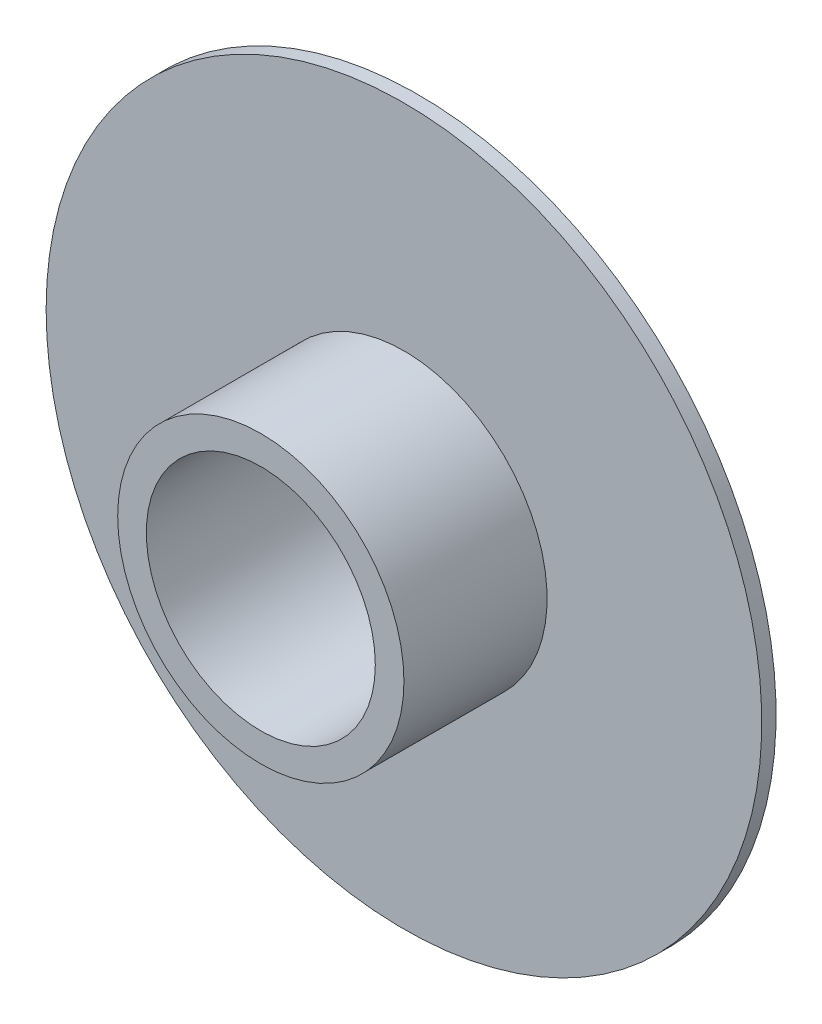
ISO-10303-21;
HEADER;
FILE_DESCRIPTION(('STEP AP214'),'2;1');
FILE_NAME('part.step','',(''),(''),'','','');
FILE_SCHEMA(('AUTOMOTIVE_DESIGN { 1 0 10303 214 1 1 1 1 }'));
ENDSEC;
DATA;
#1=APPLICATION_CONTEXT('core data for automotive mechanical design processes');
#2=APPLICATION_PROTOCOL_DEFINITION('international standard','automotive_design',2000,#1);
#3=PRODUCT_CONTEXT('',#1,'mechanical');
#4=PRODUCT('Part','Part','',(#3));
#5=PRODUCT_RELATED_PRODUCT_CATEGORY('part','',(#4));
#6=PRODUCT_DEFINITION_FORMATION('','',#4);
#7=PRODUCT_DEFINITION_CONTEXT('part definition',#1,'design');
#8=PRODUCT_DEFINITION('design','',#6,#7);
#9=PRODUCT_DEFINITION_SHAPE('','',#8);
#10=(LENGTH_UNIT() NAMED_UNIT(*) SI_UNIT(.MILLI.,.METRE.));
#11=(NAMED_UNIT(*) PLANE_ANGLE_UNIT() SI_UNIT($,.RADIAN.));
#12=(NAMED_UNIT(*) SI_UNIT($,.STERADIAN.) SOLID_ANGLE_UNIT());
#13=UNCERTAINTY_MEASURE_WITH_UNIT(LENGTH_MEASURE(1.E-05),#10,'distance_accuracy_value','');
#14=(GEOMETRIC_REPRESENTATION_CONTEXT(3) GLOBAL_UNCERTAINTY_ASSIGNED_CONTEXT((#13)) GLOBAL_UNIT_ASSIGNED_CONTEXT((#10,
#11,#12)) REPRESENTATION_CONTEXT('',''));
#15=CARTESIAN_POINT('',(0.,0.,0.));
#16=DIRECTION('',(0.,0.,1.));
#17=DIRECTION('',(1.,0.,0.));
#18=AXIS2_PLACEMENT_3D('',#15,#16,#17);
#19=CARTESIAN_POINT('',(0.,0.,3.));
#20=DIRECTION('',(0.,0.,-1.));
#21=DIRECTION('',(-1.,0.,0.));
#22=AXIS2_PLACEMENT_3D('',#19,#20,#21);
#23=CYLINDRICAL_SURFACE('',#22,5.);
#24=CARTESIAN_POINT('',(0.,0.,3.));
#25=DIRECTION('',(0.,0.,1.));
#26=DIRECTION('',(1.,0.,0.));
#27=AXIS2_PLACEMENT_3D('',#24,#25,#26);
#28=CIRCLE('',#27,5.);
#29=CARTESIAN_POINT('',(5.,0.,3.));
#30=VERTEX_POINT('',#29);
#31=EDGE_CURVE('E38',#30,#30,#28,.T.);
#32=ORIENTED_EDGE('',*,*,#31,.F.);
#33=EDGE_LOOP('',(#32));
#34=FACE_BOUND('',#33,.T.);
#35=CARTESIAN_POINT('',(0.,0.,-2.));
#36=DIRECTION('',(0.,0.,-1.));
#37=DIRECTION('',(-1.,0.,0.));
#38=AXIS2_PLACEMENT_3D('',#35,#36,#37);
#39=CIRCLE('',#38,5.);
#40=CARTESIAN_POINT('',(-5.,0.,-2.));
#41=VERTEX_POINT('',#40);
#42=EDGE_CURVE('E10',#41,#41,#39,.T.);
#43=ORIENTED_EDGE('',*,*,#42,.F.);
#44=EDGE_LOOP('',(#43));
#45=FACE_BOUND('',#44,.T.);
#46=ADVANCED_FACE('F31',(#34,#45),#23,.T.);
#47=CARTESIAN_POINT('',(0.,0.,3.));
#48=DIRECTION('',(0.,0.,1.));
#49=DIRECTION('',(1.,0.,0.));
#50=AXIS2_PLACEMENT_3D('',#47,#48,#49);
#51=PLANE('',#50);
#52=ORIENTED_EDGE('',*,*,#31,.T.);
#53=EDGE_LOOP('',(#52));
#54=FACE_BOUND('',#53,.T.);
#55=CARTESIAN_POINT('',(0.,0.,3.));
#56=DIRECTION('',(0.,0.,1.));
#57=DIRECTION('',(1.,0.,0.));
#58=AXIS2_PLACEMENT_3D('',#55,#56,#57);
#59=CIRCLE('',#58,4.);
#60=CARTESIAN_POINT('',(4.,0.,3.));
#61=VERTEX_POINT('',#60);
#62=EDGE_CURVE('E47',#61,#61,#59,.T.);
#63=ORIENTED_EDGE('',*,*,#62,.F.);
#64=EDGE_LOOP('',(#63));
#65=FACE_BOUND('',#64,.T.);
#66=ADVANCED_FACE('F86',(#54,#65),#51,.T.);
#67=CARTESIAN_POINT('',(0.,0.,-3.));
#68=DIRECTION('',(0.,0.,1.));
#69=DIRECTION('',(1.,0.,0.));
#70=AXIS2_PLACEMENT_3D('',#67,#68,#69);
#71=PLANE('',#70);
#72=CARTESIAN_POINT('',(0.,0.,-3.));
#73=DIRECTION('',(0.,0.,1.));
#74=DIRECTION('',(1.,0.,0.));
#75=AXIS2_PLACEMENT_3D('',#72,#73,#74);
#76=CIRCLE('',#75,5.);
#77=CARTESIAN_POINT('',(5.,0.,-3.));
#78=VERTEX_POINT('',#77);
#79=EDGE_CURVE('E42',#78,#78,#76,.T.);
#80=ORIENTED_EDGE('',*,*,#79,.F.);
#81=EDGE_LOOP('',(#80));
#82=FACE_BOUND('',#81,.T.);
#83=CARTESIAN_POINT('',(0.,0.,-3.));
#84=DIRECTION('',(0.,0.,1.));
#85=DIRECTION('',(1.,0.,0.));
#86=AXIS2_PLACEMENT_3D('',#83,#84,#85);
#87=CIRCLE('',#86,4.);
#88=CARTESIAN_POINT('',(4.,0.,-3.));
#89=VERTEX_POINT('',#88);
#90=EDGE_CURVE('E49',#89,#89,#87,.T.);
#91=ORIENTED_EDGE('',*,*,#90,.T.);
#92=EDGE_LOOP('',(#91));
#93=FACE_BOUND('',#92,.T.);
#94=ADVANCED_FACE('F91',(#82,#93),#71,.F.);
#95=CARTESIAN_POINT('',(0.,0.,-2.5));
#96=DIRECTION('',(0.,0.,-1.));
#97=DIRECTION('',(-1.,0.,0.));
#98=AXIS2_PLACEMENT_3D('',#95,#96,#97);
#99=CIRCLE('',#98,5.);
#100=CARTESIAN_POINT('',(-5.,0.,-2.5));
#101=VERTEX_POINT('',#100);
#102=EDGE_CURVE('E58',#101,#101,#99,.T.);
#103=ORIENTED_EDGE('',*,*,#102,.T.);
#104=EDGE_LOOP('',(#103));
#105=FACE_BOUND('',#104,.T.);
#106=ORIENTED_EDGE('',*,*,#79,.T.);
#107=EDGE_LOOP('',(#106));
#108=FACE_BOUND('',#107,.T.);
#109=ADVANCED_FACE('F33',(#105,#108),#23,.T.);
#110=CARTESIAN_POINT('',(0.,0.,3.));
#111=DIRECTION('',(0.,0.,-1.));
#112=DIRECTION('',(-1.,0.,0.));
#113=AXIS2_PLACEMENT_3D('',#110,#111,#112);
#114=CYLINDRICAL_SURFACE('',#113,4.);
#115=ORIENTED_EDGE('',*,*,#62,.T.);
#116=EDGE_LOOP('',(#115));
#117=FACE_BOUND('',#116,.T.);
#118=ORIENTED_EDGE('',*,*,#90,.F.);
#119=EDGE_LOOP('',(#118));
#120=FACE_BOUND('',#119,.T.);
#121=ADVANCED_FACE('F75',(#117,#120),#114,.F.);
#122=CARTESIAN_POINT('',(0.,0.,-2.));
#123=DIRECTION('',(0.,0.,-1.));
#124=DIRECTION('',(-1.,0.,0.));
#125=AXIS2_PLACEMENT_3D('',#122,#123,#124);
#126=CYLINDRICAL_SURFACE('',#125,12.5);
#127=CARTESIAN_POINT('',(0.,0.,-2.));
#128=DIRECTION('',(0.,0.,-1.));
#129=DIRECTION('',(-1.,0.,0.));
#130=AXIS2_PLACEMENT_3D('',#127,#128,#129);
#131=CIRCLE('',#130,12.5);
#132=CARTESIAN_POINT('',(-12.5,0.,-2.));
#133=VERTEX_POINT('',#132);
#134=EDGE_CURVE('E52',#133,#133,#131,.T.);
#135=ORIENTED_EDGE('',*,*,#134,.T.);
#136=EDGE_LOOP('',(#135));
#137=FACE_BOUND('',#136,.T.);
#138=CARTESIAN_POINT('',(0.,0.,-2.5));
#139=DIRECTION('',(0.,0.,-1.));
#140=DIRECTION('',(-1.,0.,0.));
#141=AXIS2_PLACEMENT_3D('',#138,#139,#140);
#142=CIRCLE('',#141,12.5);
#143=CARTESIAN_POINT('',(-12.5,0.,-2.5));
#144=VERTEX_POINT('',#143);
#145=EDGE_CURVE('E55',#144,#144,#142,.T.);
#146=ORIENTED_EDGE('',*,*,#145,.F.);
#147=EDGE_LOOP('',(#146));
#148=FACE_BOUND('',#147,.T.);
#149=ADVANCED_FACE('F73',(#137,#148),#126,.T.);
#150=CARTESIAN_POINT('',(0.,0.,-2.));
#151=DIRECTION('',(0.,0.,-1.));
#152=DIRECTION('',(-1.,0.,0.));
#153=AXIS2_PLACEMENT_3D('',#150,#151,#152);
#154=PLANE('',#153);
#155=ORIENTED_EDGE('',*,*,#42,.T.);
#156=EDGE_LOOP('',(#155));
#157=FACE_BOUND('',#156,.T.);
#158=ORIENTED_EDGE('',*,*,#134,.F.);
#159=EDGE_LOOP('',(#158));
#160=FACE_BOUND('',#159,.T.);
#161=ADVANCED_FACE('F69',(#157,#160),#154,.F.);
#162=CARTESIAN_POINT('',(0.,0.,-2.5));
#163=DIRECTION('',(0.,0.,-1.));
#164=DIRECTION('',(-1.,0.,0.));
#165=AXIS2_PLACEMENT_3D('',#162,#163,#164);
#166=PLANE('',#165);
#167=ORIENTED_EDGE('',*,*,#102,.F.);
#168=EDGE_LOOP('',(#167));
#169=FACE_BOUND('',#168,.T.);
#170=ORIENTED_EDGE('',*,*,#145,.T.);
#171=EDGE_LOOP('',(#170));
#172=FACE_BOUND('',#171,.T.);
#173=ADVANCED_FACE('F66',(#169,#172),#166,.T.);
#174=CLOSED_SHELL('',(#46,#66,#94,#109,#121,#149,#161,#173));
#175=MANIFOLD_SOLID_BREP('B2',#174);
#176=ADVANCED_BREP_SHAPE_REPRESENTATION('',(#18,#175),#14);
#177=SHAPE_DEFINITION_REPRESENTATION(#9,#176);
ENDSEC;
END-ISO-10303-21;
